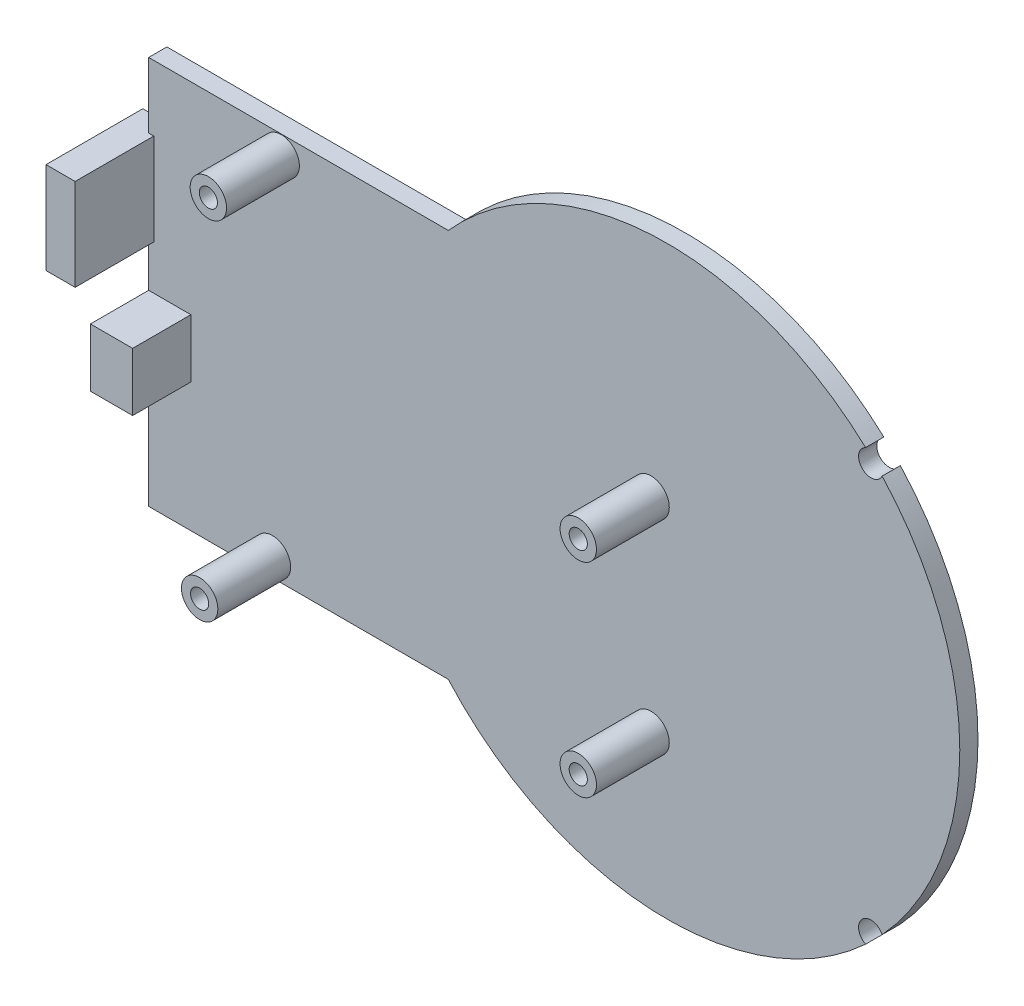
ISO-10303-21;
HEADER;
FILE_DESCRIPTION(('STEP AP214'),'2;1');
FILE_NAME('part.step','',(''),(''),'','','');
FILE_SCHEMA(('AUTOMOTIVE_DESIGN { 1 0 10303 214 1 1 1 1 }'));
ENDSEC;
DATA;
#1=APPLICATION_CONTEXT('core data for automotive mechanical design processes');
#2=APPLICATION_PROTOCOL_DEFINITION('international standard','automotive_design',2000,#1);
#3=PRODUCT_CONTEXT('',#1,'mechanical');
#4=PRODUCT('Part','Part','',(#3));
#5=PRODUCT_RELATED_PRODUCT_CATEGORY('part','',(#4));
#6=PRODUCT_DEFINITION_FORMATION('','',#4);
#7=PRODUCT_DEFINITION_CONTEXT('part definition',#1,'design');
#8=PRODUCT_DEFINITION('design','',#6,#7);
#9=PRODUCT_DEFINITION_SHAPE('','',#8);
#10=(LENGTH_UNIT() NAMED_UNIT(*) SI_UNIT(.MILLI.,.METRE.));
#11=(NAMED_UNIT(*) PLANE_ANGLE_UNIT() SI_UNIT($,.RADIAN.));
#12=(NAMED_UNIT(*) SI_UNIT($,.STERADIAN.) SOLID_ANGLE_UNIT());
#13=UNCERTAINTY_MEASURE_WITH_UNIT(LENGTH_MEASURE(1.E-05),#10,'distance_accuracy_value','');
#14=(GEOMETRIC_REPRESENTATION_CONTEXT(3) GLOBAL_UNCERTAINTY_ASSIGNED_CONTEXT((#13)) GLOBAL_UNIT_ASSIGNED_CONTEXT((#10,
#11,#12)) REPRESENTATION_CONTEXT('',''));
#15=CARTESIAN_POINT('',(0.,0.,0.));
#16=DIRECTION('',(0.,0.,1.));
#17=DIRECTION('',(1.,0.,0.));
#18=AXIS2_PLACEMENT_3D('',#15,#16,#17);
#19=CARTESIAN_POINT('',(0.,0.,8.5));
#20=DIRECTION('',(0.,0.,-1.));
#21=DIRECTION('',(-1.,0.,0.));
#22=AXIS2_PLACEMENT_3D('',#19,#20,#21);
#23=PLANE('',#22);
#24=CARTESIAN_POINT('',(-54.2,-24.17,8.5));
#25=DIRECTION('',(0.,0.,1.));
#26=DIRECTION('',(1.,0.,0.));
#27=AXIS2_PLACEMENT_3D('',#24,#25,#26);
#28=CIRCLE('',#27,2.5);
#29=CARTESIAN_POINT('',(-51.7,-24.17,8.5));
#30=VERTEX_POINT('',#29);
#31=EDGE_CURVE('E314',#30,#30,#28,.T.);
#32=ORIENTED_EDGE('',*,*,#31,.F.);
#33=EDGE_LOOP('',(#32));
#34=FACE_BOUND('',#33,.T.);
#35=CARTESIAN_POINT('',(-2.2,8.93,8.5));
#36=DIRECTION('',(0.,0.,1.));
#37=DIRECTION('',(1.,0.,0.));
#38=AXIS2_PLACEMENT_3D('',#35,#36,#37);
#39=CIRCLE('',#38,2.5);
#40=CARTESIAN_POINT('',(0.3,8.93,8.5));
#41=VERTEX_POINT('',#40);
#42=EDGE_CURVE('E317',#41,#41,#39,.T.);
#43=ORIENTED_EDGE('',*,*,#42,.F.);
#44=EDGE_LOOP('',(#43));
#45=FACE_BOUND('',#44,.T.);
#46=CARTESIAN_POINT('',(-2.2,-19.07,8.5));
#47=DIRECTION('',(0.,0.,1.));
#48=DIRECTION('',(1.,0.,0.));
#49=AXIS2_PLACEMENT_3D('',#46,#47,#48);
#50=CIRCLE('',#49,2.5);
#51=CARTESIAN_POINT('',(0.3,-19.07,8.5));
#52=VERTEX_POINT('',#51);
#53=EDGE_CURVE('E323',#52,#52,#50,.T.);
#54=ORIENTED_EDGE('',*,*,#53,.F.);
#55=EDGE_LOOP('',(#54));
#56=FACE_BOUND('',#55,.T.);
#57=CARTESIAN_POINT('',(-53.,24.13,8.5));
#58=DIRECTION('',(0.,0.,1.));
#59=DIRECTION('',(1.,0.,0.));
#60=AXIS2_PLACEMENT_3D('',#57,#58,#59);
#61=CIRCLE('',#60,2.5);
#62=CARTESIAN_POINT('',(-50.5,24.13,8.5));
#63=VERTEX_POINT('',#62);
#64=EDGE_CURVE('E327',#63,#63,#61,.T.);
#65=ORIENTED_EDGE('',*,*,#64,.F.);
#66=EDGE_LOOP('',(#65));
#67=FACE_BOUND('',#66,.T.);
#68=DIRECTION('',(1.,0.,0.));
#69=VECTOR('',#68,1.);
#70=CARTESIAN_POINT('',(0.,5.1,8.5));
#71=LINE('',#70,#69);
#72=CARTESIAN_POINT('',(-71.2,5.09999999999999,8.5));
#73=VERTEX_POINT('',#72);
#74=CARTESIAN_POINT('',(-70.5,5.1,8.5));
#75=VERTEX_POINT('',#74);
#76=EDGE_CURVE('E207',#73,#75,#71,.T.);
#77=ORIENTED_EDGE('',*,*,#76,.F.);
#78=DIRECTION('',(0.,-1.,0.));
#79=VECTOR('',#78,1.);
#80=CARTESIAN_POINT('',(-71.2,-26.7,8.5));
#81=LINE('',#80,#79);
#82=CARTESIAN_POINT('',(-71.2,-1.00000000000001,8.5));
#83=VERTEX_POINT('',#82);
#84=EDGE_CURVE('E368',#73,#83,#81,.T.);
#85=ORIENTED_EDGE('',*,*,#84,.T.);
#86=DIRECTION('',(-1.,0.,0.));
#87=VECTOR('',#86,1.);
#88=CARTESIAN_POINT('',(-71.2,-1.,8.5));
#89=LINE('',#88,#87);
#90=CARTESIAN_POINT('',(-65.4,-1.,8.5));
#91=VERTEX_POINT('',#90);
#92=EDGE_CURVE('E275',#91,#83,#89,.T.);
#93=ORIENTED_EDGE('',*,*,#92,.F.);
#94=DIRECTION('',(0.,1.,0.));
#95=VECTOR('',#94,1.);
#96=CARTESIAN_POINT('',(-65.4,-9.,8.5));
#97=LINE('',#96,#95);
#98=CARTESIAN_POINT('',(-65.4,-9.,8.5));
#99=VERTEX_POINT('',#98);
#100=EDGE_CURVE('E282',#99,#91,#97,.T.);
#101=ORIENTED_EDGE('',*,*,#100,.F.);
#102=DIRECTION('',(1.,0.,0.));
#103=VECTOR('',#102,1.);
#104=CARTESIAN_POINT('',(-71.2,-9.,8.5));
#105=LINE('',#104,#103);
#106=CARTESIAN_POINT('',(-71.2,-9.00000000000001,8.5));
#107=VERTEX_POINT('',#106);
#108=EDGE_CURVE('E266',#107,#99,#105,.T.);
#109=ORIENTED_EDGE('',*,*,#108,.F.);
#110=CARTESIAN_POINT('',(-71.2,-26.7,8.5));
#111=VERTEX_POINT('',#110);
#112=EDGE_CURVE('E370',#107,#111,#81,.T.);
#113=ORIENTED_EDGE('',*,*,#112,.T.);
#114=DIRECTION('',(1.,0.,0.));
#115=VECTOR('',#114,1.);
#116=CARTESIAN_POINT('',(-71.2,-26.7,8.5));
#117=LINE('',#116,#115);
#118=CARTESIAN_POINT('',(-30.0524541427152,-26.7,8.5));
#119=VERTEX_POINT('',#118);
#120=EDGE_CURVE('E364',#111,#119,#117,.T.);
#121=ORIENTED_EDGE('',*,*,#120,.T.);
#122=CARTESIAN_POINT('',(0.,0.,8.5));
#123=DIRECTION('',(0.,0.,1.));
#124=DIRECTION('',(1.,0.,0.));
#125=AXIS2_PLACEMENT_3D('',#122,#123,#124);
#126=CIRCLE('',#125,40.2);
#127=CARTESIAN_POINT('',(27.2706541463464,-29.5355958536536,8.5));
#128=VERTEX_POINT('',#127);
#129=EDGE_CURVE('E345',#119,#128,#126,.T.);
#130=ORIENTED_EDGE('',*,*,#129,.T.);
#131=CARTESIAN_POINT('',(28.,-28.,8.5));
#132=DIRECTION('',(0.,0.,-1.));
#133=DIRECTION('',(-1.,0.,0.));
#134=AXIS2_PLACEMENT_3D('',#131,#132,#133);
#135=CIRCLE('',#134,1.7);
#136=CARTESIAN_POINT('',(29.5355958536536,-27.2706541463464,8.5));
#137=VERTEX_POINT('',#136);
#138=EDGE_CURVE('E263',#137,#128,#135,.F.);
#139=ORIENTED_EDGE('',*,*,#138,.F.);
#140=CARTESIAN_POINT('',(29.5355958536536,27.2706541463464,8.5));
#141=VERTEX_POINT('',#140);
#142=EDGE_CURVE('E350',#137,#141,#126,.T.);
#143=ORIENTED_EDGE('',*,*,#142,.T.);
#144=CARTESIAN_POINT('',(28.,28.,8.5));
#145=DIRECTION('',(0.,0.,-1.));
#146=DIRECTION('',(-1.,0.,0.));
#147=AXIS2_PLACEMENT_3D('',#144,#145,#146);
#148=CIRCLE('',#147,1.7);
#149=CARTESIAN_POINT('',(27.2706541463464,29.5355958536536,8.5));
#150=VERTEX_POINT('',#149);
#151=EDGE_CURVE('E260',#150,#141,#148,.F.);
#152=ORIENTED_EDGE('',*,*,#151,.F.);
#153=CARTESIAN_POINT('',(-30.0524541427152,26.7,8.5));
#154=VERTEX_POINT('',#153);
#155=EDGE_CURVE('E346',#150,#154,#126,.T.);
#156=ORIENTED_EDGE('',*,*,#155,.T.);
#157=DIRECTION('',(-1.,0.,0.));
#158=VECTOR('',#157,1.);
#159=CARTESIAN_POINT('',(-71.2,26.7,8.5));
#160=LINE('',#159,#158);
#161=CARTESIAN_POINT('',(-71.2,26.7,8.5));
#162=VERTEX_POINT('',#161);
#163=EDGE_CURVE('E371',#154,#162,#160,.T.);
#164=ORIENTED_EDGE('',*,*,#163,.T.);
#165=CARTESIAN_POINT('',(-71.2,17.7,8.5));
#166=VERTEX_POINT('',#165);
#167=EDGE_CURVE('E362',#162,#166,#81,.T.);
#168=ORIENTED_EDGE('',*,*,#167,.T.);
#169=DIRECTION('',(-1.,0.,0.));
#170=VECTOR('',#169,1.);
#171=CARTESIAN_POINT('',(0.,17.7,8.5));
#172=LINE('',#171,#170);
#173=CARTESIAN_POINT('',(-70.5,17.7,8.5));
#174=VERTEX_POINT('',#173);
#175=EDGE_CURVE('E68',#174,#166,#172,.T.);
#176=ORIENTED_EDGE('',*,*,#175,.F.);
#177=DIRECTION('',(0.,1.,0.));
#178=VECTOR('',#177,1.);
#179=CARTESIAN_POINT('',(-70.5,0.,8.5));
#180=LINE('',#179,#178);
#181=EDGE_CURVE('E64',#75,#174,#180,.T.);
#182=ORIENTED_EDGE('',*,*,#181,.F.);
#183=EDGE_LOOP('',(#77,#85,#93,#101,#109,#113,#121,#130,#139,#143,#152,#156,#164,#168,#176,#182));
#184=FACE_BOUND('',#183,.T.);
#185=ADVANCED_FACE('F44',(#34,#45,#56,#67,#184),#23,.F.);
#186=CARTESIAN_POINT('',(-71.2,-26.7,8.5));
#187=DIRECTION('',(1.,0.,0.));
#188=DIRECTION('',(0.,0.,-1.));
#189=AXIS2_PLACEMENT_3D('',#186,#187,#188);
#190=PLANE('',#189);
#191=CARTESIAN_POINT('',(-71.2,-5.,12.5));
#192=DIRECTION('',(1.,0.,0.));
#193=DIRECTION('',(0.,0.,-1.));
#194=AXIS2_PLACEMENT_3D('',#191,#192,#193);
#195=CIRCLE('',#194,2.1);
#196=CARTESIAN_POINT('',(-71.2,-5.,10.4));
#197=VERTEX_POINT('',#196);
#198=EDGE_CURVE('E215',#197,#197,#195,.T.);
#199=ORIENTED_EDGE('',*,*,#198,.T.);
#200=EDGE_LOOP('',(#199));
#201=FACE_BOUND('',#200,.T.);
#202=DIRECTION('',(0.,0.,1.));
#203=VECTOR('',#202,1.);
#204=CARTESIAN_POINT('',(-71.2,5.1,8.5));
#205=LINE('',#204,#203);
#206=CARTESIAN_POINT('',(-71.2,5.09999999999999,6.));
#207=VERTEX_POINT('',#206);
#208=EDGE_CURVE('E11',#207,#73,#205,.T.);
#209=ORIENTED_EDGE('',*,*,#208,.F.);
#210=DIRECTION('',(0.,-1.,0.));
#211=VECTOR('',#210,1.);
#212=CARTESIAN_POINT('',(-71.2,-26.7,6.));
#213=LINE('',#212,#211);
#214=CARTESIAN_POINT('',(-71.2,-26.7,6.));
#215=VERTEX_POINT('',#214);
#216=EDGE_CURVE('E363',#207,#215,#213,.T.);
#217=ORIENTED_EDGE('',*,*,#216,.T.);
#218=DIRECTION('',(0.,0.,-1.));
#219=VECTOR('',#218,1.);
#220=CARTESIAN_POINT('',(-71.2,-26.7,8.5));
#221=LINE('',#220,#219);
#222=EDGE_CURVE('E335',#111,#215,#221,.T.);
#223=ORIENTED_EDGE('',*,*,#222,.F.);
#224=ORIENTED_EDGE('',*,*,#112,.F.);
#225=DIRECTION('',(0.,0.,-1.));
#226=VECTOR('',#225,1.);
#227=CARTESIAN_POINT('',(-71.2,-9.,16.5));
#228=LINE('',#227,#226);
#229=CARTESIAN_POINT('',(-71.2,-9.,16.5));
#230=VERTEX_POINT('',#229);
#231=EDGE_CURVE('E301',#230,#107,#228,.T.);
#232=ORIENTED_EDGE('',*,*,#231,.F.);
#233=DIRECTION('',(0.,-1.,0.));
#234=VECTOR('',#233,1.);
#235=CARTESIAN_POINT('',(-71.2,-9.,16.5));
#236=LINE('',#235,#234);
#237=CARTESIAN_POINT('',(-71.2,-1.,16.5));
#238=VERTEX_POINT('',#237);
#239=EDGE_CURVE('E270',#238,#230,#236,.T.);
#240=ORIENTED_EDGE('',*,*,#239,.F.);
#241=DIRECTION('',(0.,0.,-1.));
#242=VECTOR('',#241,1.);
#243=CARTESIAN_POINT('',(-71.2,-1.,16.5));
#244=LINE('',#243,#242);
#245=EDGE_CURVE('E284',#238,#83,#244,.T.);
#246=ORIENTED_EDGE('',*,*,#245,.T.);
#247=ORIENTED_EDGE('',*,*,#84,.F.);
#248=EDGE_LOOP('',(#209,#217,#223,#224,#232,#240,#246,#247));
#249=FACE_BOUND('',#248,.T.);
#250=ADVANCED_FACE('F50',(#201,#249),#190,.F.);
#251=DIRECTION('',(0.,0.,-1.));
#252=VECTOR('',#251,1.);
#253=CARTESIAN_POINT('',(-71.2,17.7,8.5));
#254=LINE('',#253,#252);
#255=CARTESIAN_POINT('',(-71.2,17.7,6.));
#256=VERTEX_POINT('',#255);
#257=EDGE_CURVE('E53',#166,#256,#254,.T.);
#258=ORIENTED_EDGE('',*,*,#257,.F.);
#259=ORIENTED_EDGE('',*,*,#167,.F.);
#260=DIRECTION('',(0.,0.,-1.));
#261=VECTOR('',#260,1.);
#262=CARTESIAN_POINT('',(-71.2,26.7,8.5));
#263=LINE('',#262,#261);
#264=CARTESIAN_POINT('',(-71.2,26.7,6.));
#265=VERTEX_POINT('',#264);
#266=EDGE_CURVE('E372',#162,#265,#263,.T.);
#267=ORIENTED_EDGE('',*,*,#266,.T.);
#268=EDGE_CURVE('E374',#265,#256,#213,.T.);
#269=ORIENTED_EDGE('',*,*,#268,.T.);
#270=EDGE_LOOP('',(#258,#259,#267,#269));
#271=FACE_BOUND('',#270,.T.);
#272=ADVANCED_FACE('F450',(#271),#190,.F.);
#273=CARTESIAN_POINT('',(0.,0.,8.5));
#274=DIRECTION('',(0.,0.,-1.));
#275=DIRECTION('',(-1.,0.,0.));
#276=AXIS2_PLACEMENT_3D('',#273,#274,#275);
#277=CYLINDRICAL_SURFACE('',#276,40.2);
#278=DIRECTION('',(0.,0.,-1.));
#279=VECTOR('',#278,1.);
#280=CARTESIAN_POINT('',(27.2706541463464,-29.5355958536536,12.25));
#281=LINE('',#280,#279);
#282=CARTESIAN_POINT('',(27.2706541463464,-29.5355958536536,6.));
#283=VERTEX_POINT('',#282);
#284=EDGE_CURVE('E396',#128,#283,#281,.T.);
#285=ORIENTED_EDGE('',*,*,#284,.F.);
#286=ORIENTED_EDGE('',*,*,#129,.F.);
#287=DIRECTION('',(0.,0.,-1.));
#288=VECTOR('',#287,1.);
#289=CARTESIAN_POINT('',(-30.0524541427152,-26.7,8.5));
#290=LINE('',#289,#288);
#291=CARTESIAN_POINT('',(-30.0524541427152,-26.7,6.));
#292=VERTEX_POINT('',#291);
#293=EDGE_CURVE('E360',#119,#292,#290,.T.);
#294=ORIENTED_EDGE('',*,*,#293,.T.);
#295=CARTESIAN_POINT('',(0.,0.,6.));
#296=DIRECTION('',(0.,0.,1.));
#297=DIRECTION('',(1.,0.,0.));
#298=AXIS2_PLACEMENT_3D('',#295,#296,#297);
#299=CIRCLE('',#298,40.2);
#300=EDGE_CURVE('E349',#292,#283,#299,.T.);
#301=ORIENTED_EDGE('',*,*,#300,.T.);
#302=EDGE_LOOP('',(#285,#286,#294,#301));
#303=FACE_BOUND('',#302,.T.);
#304=ADVANCED_FACE('F452',(#303),#277,.T.);
#305=DIRECTION('',(0.,0.,-1.));
#306=VECTOR('',#305,1.);
#307=CARTESIAN_POINT('',(29.5355958536536,-27.2706541463464,12.25));
#308=LINE('',#307,#306);
#309=CARTESIAN_POINT('',(29.5355958536536,-27.2706541463464,6.));
#310=VERTEX_POINT('',#309);
#311=EDGE_CURVE('E392',#310,#137,#308,.F.);
#312=ORIENTED_EDGE('',*,*,#311,.F.);
#313=CARTESIAN_POINT('',(29.5355958536536,27.2706541463464,6.));
#314=VERTEX_POINT('',#313);
#315=EDGE_CURVE('E355',#310,#314,#299,.T.);
#316=ORIENTED_EDGE('',*,*,#315,.T.);
#317=DIRECTION('',(0.,0.,-1.));
#318=VECTOR('',#317,1.);
#319=CARTESIAN_POINT('',(29.5355958536536,27.2706541463464,12.25));
#320=LINE('',#319,#318);
#321=EDGE_CURVE('E391',#141,#314,#320,.T.);
#322=ORIENTED_EDGE('',*,*,#321,.F.);
#323=ORIENTED_EDGE('',*,*,#142,.F.);
#324=EDGE_LOOP('',(#312,#316,#322,#323));
#325=FACE_BOUND('',#324,.T.);
#326=ADVANCED_FACE('F467',(#325),#277,.T.);
#327=DIRECTION('',(0.,0.,-1.));
#328=VECTOR('',#327,1.);
#329=CARTESIAN_POINT('',(27.2706541463464,29.5355958536536,12.25));
#330=LINE('',#329,#328);
#331=CARTESIAN_POINT('',(27.2706541463464,29.5355958536536,6.));
#332=VERTEX_POINT('',#331);
#333=EDGE_CURVE('E318',#332,#150,#330,.F.);
#334=ORIENTED_EDGE('',*,*,#333,.F.);
#335=CARTESIAN_POINT('',(-30.0524541427152,26.7,6.));
#336=VERTEX_POINT('',#335);
#337=EDGE_CURVE('E315',#332,#336,#299,.T.);
#338=ORIENTED_EDGE('',*,*,#337,.T.);
#339=DIRECTION('',(0.,0.,-1.));
#340=VECTOR('',#339,1.);
#341=CARTESIAN_POINT('',(-30.0524541427152,26.7,8.5));
#342=LINE('',#341,#340);
#343=EDGE_CURVE('E347',#336,#154,#342,.F.);
#344=ORIENTED_EDGE('',*,*,#343,.T.);
#345=ORIENTED_EDGE('',*,*,#155,.F.);
#346=EDGE_LOOP('',(#334,#338,#344,#345));
#347=FACE_BOUND('',#346,.T.);
#348=ADVANCED_FACE('F463',(#347),#277,.T.);
#349=CARTESIAN_POINT('',(-71.2,-26.7,8.5));
#350=DIRECTION('',(0.,1.,0.));
#351=DIRECTION('',(0.,0.,1.));
#352=AXIS2_PLACEMENT_3D('',#349,#350,#351);
#353=PLANE('',#352);
#354=ORIENTED_EDGE('',*,*,#293,.F.);
#355=ORIENTED_EDGE('',*,*,#120,.F.);
#356=ORIENTED_EDGE('',*,*,#222,.T.);
#357=DIRECTION('',(1.,0.,0.));
#358=VECTOR('',#357,1.);
#359=CARTESIAN_POINT('',(-71.2,-26.7,6.));
#360=LINE('',#359,#358);
#361=EDGE_CURVE('E378',#215,#292,#360,.T.);
#362=ORIENTED_EDGE('',*,*,#361,.T.);
#363=EDGE_LOOP('',(#354,#355,#356,#362));
#364=FACE_BOUND('',#363,.T.);
#365=ADVANCED_FACE('F464',(#364),#353,.F.);
#366=CARTESIAN_POINT('',(-71.2,26.7,8.5));
#367=DIRECTION('',(0.,-1.,0.));
#368=DIRECTION('',(0.,0.,-1.));
#369=AXIS2_PLACEMENT_3D('',#366,#367,#368);
#370=PLANE('',#369);
#371=ORIENTED_EDGE('',*,*,#343,.F.);
#372=DIRECTION('',(-1.,0.,0.));
#373=VECTOR('',#372,1.);
#374=CARTESIAN_POINT('',(-71.2,26.7,6.));
#375=LINE('',#374,#373);
#376=EDGE_CURVE('E381',#336,#265,#375,.T.);
#377=ORIENTED_EDGE('',*,*,#376,.T.);
#378=ORIENTED_EDGE('',*,*,#266,.F.);
#379=ORIENTED_EDGE('',*,*,#163,.F.);
#380=EDGE_LOOP('',(#371,#377,#378,#379));
#381=FACE_BOUND('',#380,.T.);
#382=ADVANCED_FACE('F459',(#381),#370,.F.);
#383=CARTESIAN_POINT('',(0.,0.,6.));
#384=DIRECTION('',(0.,0.,-1.));
#385=DIRECTION('',(-1.,0.,0.));
#386=AXIS2_PLACEMENT_3D('',#383,#384,#385);
#387=PLANE('',#386);
#388=ORIENTED_EDGE('',*,*,#216,.F.);
#389=DIRECTION('',(1.,0.,0.));
#390=VECTOR('',#389,1.);
#391=CARTESIAN_POINT('',(-74.5,5.1,6.));
#392=LINE('',#391,#390);
#393=CARTESIAN_POINT('',(-74.5,5.1,6.));
#394=VERTEX_POINT('',#393);
#395=EDGE_CURVE('E414',#394,#207,#392,.T.);
#396=ORIENTED_EDGE('',*,*,#395,.F.);
#397=DIRECTION('',(0.,-1.,0.));
#398=VECTOR('',#397,1.);
#399=CARTESIAN_POINT('',(-74.5,17.7,6.));
#400=LINE('',#399,#398);
#401=CARTESIAN_POINT('',(-74.5,17.7,6.));
#402=VERTEX_POINT('',#401);
#403=EDGE_CURVE('E197',#402,#394,#400,.T.);
#404=ORIENTED_EDGE('',*,*,#403,.F.);
#405=DIRECTION('',(-1.,0.,0.));
#406=VECTOR('',#405,1.);
#407=CARTESIAN_POINT('',(-70.5,17.7,6.));
#408=LINE('',#407,#406);
#409=EDGE_CURVE('E191',#256,#402,#408,.T.);
#410=ORIENTED_EDGE('',*,*,#409,.F.);
#411=ORIENTED_EDGE('',*,*,#268,.F.);
#412=ORIENTED_EDGE('',*,*,#376,.F.);
#413=ORIENTED_EDGE('',*,*,#337,.F.);
#414=CARTESIAN_POINT('',(28.,28.,6.));
#415=DIRECTION('',(0.,0.,1.));
#416=DIRECTION('',(1.,0.,0.));
#417=AXIS2_PLACEMENT_3D('',#414,#415,#416);
#418=CIRCLE('',#417,1.7);
#419=EDGE_CURVE('E227',#332,#314,#418,.T.);
#420=ORIENTED_EDGE('',*,*,#419,.T.);
#421=ORIENTED_EDGE('',*,*,#315,.F.);
#422=CARTESIAN_POINT('',(28.,-28.,6.));
#423=DIRECTION('',(0.,0.,1.));
#424=DIRECTION('',(1.,0.,0.));
#425=AXIS2_PLACEMENT_3D('',#422,#423,#424);
#426=CIRCLE('',#425,1.7);
#427=EDGE_CURVE('E220',#310,#283,#426,.T.);
#428=ORIENTED_EDGE('',*,*,#427,.T.);
#429=ORIENTED_EDGE('',*,*,#300,.F.);
#430=ORIENTED_EDGE('',*,*,#361,.F.);
#431=EDGE_LOOP('',(#388,#396,#404,#410,#411,#412,#413,#420,#421,#428,#429,#430));
#432=FACE_BOUND('',#431,.T.);
#433=CARTESIAN_POINT('',(-53.,24.13,6.));
#434=DIRECTION('',(0.,0.,1.));
#435=DIRECTION('',(1.,0.,0.));
#436=AXIS2_PLACEMENT_3D('',#433,#434,#435);
#437=CIRCLE('',#436,1.25);
#438=CARTESIAN_POINT('',(-51.75,24.13,6.));
#439=VERTEX_POINT('',#438);
#440=EDGE_CURVE('E232',#439,#439,#437,.T.);
#441=ORIENTED_EDGE('',*,*,#440,.T.);
#442=EDGE_LOOP('',(#441));
#443=FACE_BOUND('',#442,.T.);
#444=CARTESIAN_POINT('',(-2.2,-19.07,6.));
#445=DIRECTION('',(0.,0.,1.));
#446=DIRECTION('',(1.,0.,0.));
#447=AXIS2_PLACEMENT_3D('',#444,#445,#446);
#448=CIRCLE('',#447,1.25);
#449=CARTESIAN_POINT('',(-0.95,-19.07,6.));
#450=VERTEX_POINT('',#449);
#451=EDGE_CURVE('E245',#450,#450,#448,.T.);
#452=ORIENTED_EDGE('',*,*,#451,.T.);
#453=EDGE_LOOP('',(#452));
#454=FACE_BOUND('',#453,.T.);
#455=CARTESIAN_POINT('',(-2.2,8.93,6.));
#456=DIRECTION('',(0.,0.,1.));
#457=DIRECTION('',(1.,0.,0.));
#458=AXIS2_PLACEMENT_3D('',#455,#456,#457);
#459=CIRCLE('',#458,1.25);
#460=CARTESIAN_POINT('',(-0.95,8.93,6.));
#461=VERTEX_POINT('',#460);
#462=EDGE_CURVE('E222',#461,#461,#459,.T.);
#463=ORIENTED_EDGE('',*,*,#462,.T.);
#464=EDGE_LOOP('',(#463));
#465=FACE_BOUND('',#464,.T.);
#466=CARTESIAN_POINT('',(-54.2,-24.17,6.));
#467=DIRECTION('',(0.,0.,1.));
#468=DIRECTION('',(1.,0.,0.));
#469=AXIS2_PLACEMENT_3D('',#466,#467,#468);
#470=CIRCLE('',#469,1.25);
#471=CARTESIAN_POINT('',(-52.95,-24.17,6.));
#472=VERTEX_POINT('',#471);
#473=EDGE_CURVE('E236',#472,#472,#470,.T.);
#474=ORIENTED_EDGE('',*,*,#473,.T.);
#475=EDGE_LOOP('',(#474));
#476=FACE_BOUND('',#475,.T.);
#477=ADVANCED_FACE('F413',(#432,#443,#454,#465,#476),#387,.T.);
#478=CARTESIAN_POINT('',(-53.,24.13,18.5));
#479=DIRECTION('',(0.,0.,-1.));
#480=DIRECTION('',(-1.,0.,0.));
#481=AXIS2_PLACEMENT_3D('',#478,#479,#480);
#482=CYLINDRICAL_SURFACE('',#481,2.5);
#483=CARTESIAN_POINT('',(-53.,24.13,18.5));
#484=DIRECTION('',(0.,0.,1.));
#485=DIRECTION('',(1.,0.,0.));
#486=AXIS2_PLACEMENT_3D('',#483,#484,#485);
#487=CIRCLE('',#486,2.5);
#488=CARTESIAN_POINT('',(-50.5,24.13,18.5));
#489=VERTEX_POINT('',#488);
#490=EDGE_CURVE('E311',#489,#489,#487,.T.);
#491=ORIENTED_EDGE('',*,*,#490,.F.);
#492=EDGE_LOOP('',(#491));
#493=FACE_BOUND('',#492,.T.);
#494=ORIENTED_EDGE('',*,*,#64,.T.);
#495=EDGE_LOOP('',(#494));
#496=FACE_BOUND('',#495,.T.);
#497=ADVANCED_FACE('F456',(#493,#496),#482,.T.);
#498=CARTESIAN_POINT('',(-53.,24.13,18.5));
#499=DIRECTION('',(0.,0.,1.));
#500=DIRECTION('',(1.,0.,0.));
#501=AXIS2_PLACEMENT_3D('',#498,#499,#500);
#502=PLANE('',#501);
#503=CARTESIAN_POINT('',(-53.,24.13,18.5));
#504=DIRECTION('',(0.,0.,1.));
#505=DIRECTION('',(1.,0.,0.));
#506=AXIS2_PLACEMENT_3D('',#503,#504,#505);
#507=CIRCLE('',#506,1.25);
#508=CARTESIAN_POINT('',(-51.75,24.13,18.5));
#509=VERTEX_POINT('',#508);
#510=EDGE_CURVE('E239',#509,#509,#507,.T.);
#511=ORIENTED_EDGE('',*,*,#510,.F.);
#512=EDGE_LOOP('',(#511));
#513=FACE_BOUND('',#512,.T.);
#514=ORIENTED_EDGE('',*,*,#490,.T.);
#515=EDGE_LOOP('',(#514));
#516=FACE_BOUND('',#515,.T.);
#517=ADVANCED_FACE('F557',(#513,#516),#502,.T.);
#518=CARTESIAN_POINT('',(-2.2,-19.07,18.5));
#519=DIRECTION('',(0.,0.,-1.));
#520=DIRECTION('',(-1.,0.,0.));
#521=AXIS2_PLACEMENT_3D('',#518,#519,#520);
#522=CYLINDRICAL_SURFACE('',#521,2.5);
#523=CARTESIAN_POINT('',(-2.2,-19.07,18.5));
#524=DIRECTION('',(0.,0.,1.));
#525=DIRECTION('',(1.,0.,0.));
#526=AXIS2_PLACEMENT_3D('',#523,#524,#525);
#527=CIRCLE('',#526,2.5);
#528=CARTESIAN_POINT('',(0.3,-19.07,18.5));
#529=VERTEX_POINT('',#528);
#530=EDGE_CURVE('E330',#529,#529,#527,.T.);
#531=ORIENTED_EDGE('',*,*,#530,.F.);
#532=EDGE_LOOP('',(#531));
#533=FACE_BOUND('',#532,.T.);
#534=ORIENTED_EDGE('',*,*,#53,.T.);
#535=EDGE_LOOP('',(#534));
#536=FACE_BOUND('',#535,.T.);
#537=ADVANCED_FACE('F562',(#533,#536),#522,.T.);
#538=CARTESIAN_POINT('',(-2.2,-19.07,18.5));
#539=DIRECTION('',(0.,0.,1.));
#540=DIRECTION('',(1.,0.,0.));
#541=AXIS2_PLACEMENT_3D('',#538,#539,#540);
#542=PLANE('',#541);
#543=CARTESIAN_POINT('',(-2.2,-19.07,18.5));
#544=DIRECTION('',(0.,0.,1.));
#545=DIRECTION('',(1.,0.,0.));
#546=AXIS2_PLACEMENT_3D('',#543,#544,#545);
#547=CIRCLE('',#546,1.25);
#548=CARTESIAN_POINT('',(-0.95,-19.07,18.5));
#549=VERTEX_POINT('',#548);
#550=EDGE_CURVE('E223',#549,#549,#547,.T.);
#551=ORIENTED_EDGE('',*,*,#550,.F.);
#552=EDGE_LOOP('',(#551));
#553=FACE_BOUND('',#552,.T.);
#554=ORIENTED_EDGE('',*,*,#530,.T.);
#555=EDGE_LOOP('',(#554));
#556=FACE_BOUND('',#555,.T.);
#557=ADVANCED_FACE('F554',(#553,#556),#542,.T.);
#558=CARTESIAN_POINT('',(-2.2,8.93,18.5));
#559=DIRECTION('',(0.,0.,-1.));
#560=DIRECTION('',(-1.,0.,0.));
#561=AXIS2_PLACEMENT_3D('',#558,#559,#560);
#562=CYLINDRICAL_SURFACE('',#561,2.5);
#563=CARTESIAN_POINT('',(-2.2,8.93,18.5));
#564=DIRECTION('',(0.,0.,1.));
#565=DIRECTION('',(1.,0.,0.));
#566=AXIS2_PLACEMENT_3D('',#563,#564,#565);
#567=CIRCLE('',#566,2.5);
#568=CARTESIAN_POINT('',(0.3,8.93,18.5));
#569=VERTEX_POINT('',#568);
#570=EDGE_CURVE('E307',#569,#569,#567,.T.);
#571=ORIENTED_EDGE('',*,*,#570,.F.);
#572=EDGE_LOOP('',(#571));
#573=FACE_BOUND('',#572,.T.);
#574=ORIENTED_EDGE('',*,*,#42,.T.);
#575=EDGE_LOOP('',(#574));
#576=FACE_BOUND('',#575,.T.);
#577=ADVANCED_FACE('F549',(#573,#576),#562,.T.);
#578=CARTESIAN_POINT('',(-2.2,8.93,18.5));
#579=DIRECTION('',(0.,0.,1.));
#580=DIRECTION('',(1.,0.,0.));
#581=AXIS2_PLACEMENT_3D('',#578,#579,#580);
#582=PLANE('',#581);
#583=CARTESIAN_POINT('',(-2.2,8.93,18.5));
#584=DIRECTION('',(0.,0.,1.));
#585=DIRECTION('',(1.,0.,0.));
#586=AXIS2_PLACEMENT_3D('',#583,#584,#585);
#587=CIRCLE('',#586,1.25);
#588=CARTESIAN_POINT('',(-0.95,8.93,18.5));
#589=VERTEX_POINT('',#588);
#590=EDGE_CURVE('E229',#589,#589,#587,.T.);
#591=ORIENTED_EDGE('',*,*,#590,.F.);
#592=EDGE_LOOP('',(#591));
#593=FACE_BOUND('',#592,.T.);
#594=ORIENTED_EDGE('',*,*,#570,.T.);
#595=EDGE_LOOP('',(#594));
#596=FACE_BOUND('',#595,.T.);
#597=ADVANCED_FACE('F547',(#593,#596),#582,.T.);
#598=CARTESIAN_POINT('',(-54.2,-24.17,18.5));
#599=DIRECTION('',(0.,0.,-1.));
#600=DIRECTION('',(-1.,0.,0.));
#601=AXIS2_PLACEMENT_3D('',#598,#599,#600);
#602=CYLINDRICAL_SURFACE('',#601,2.5);
#603=CARTESIAN_POINT('',(-54.2,-24.17,18.5));
#604=DIRECTION('',(0.,0.,1.));
#605=DIRECTION('',(1.,0.,0.));
#606=AXIS2_PLACEMENT_3D('',#603,#604,#605);
#607=CIRCLE('',#606,2.5);
#608=CARTESIAN_POINT('',(-51.7,-24.17,18.5));
#609=VERTEX_POINT('',#608);
#610=EDGE_CURVE('E306',#609,#609,#607,.T.);
#611=ORIENTED_EDGE('',*,*,#610,.F.);
#612=EDGE_LOOP('',(#611));
#613=FACE_BOUND('',#612,.T.);
#614=ORIENTED_EDGE('',*,*,#31,.T.);
#615=EDGE_LOOP('',(#614));
#616=FACE_BOUND('',#615,.T.);
#617=ADVANCED_FACE('F542',(#613,#616),#602,.T.);
#618=CARTESIAN_POINT('',(-54.2,-24.17,18.5));
#619=DIRECTION('',(0.,0.,1.));
#620=DIRECTION('',(1.,0.,0.));
#621=AXIS2_PLACEMENT_3D('',#618,#619,#620);
#622=PLANE('',#621);
#623=CARTESIAN_POINT('',(-54.2,-24.17,18.5));
#624=DIRECTION('',(0.,0.,1.));
#625=DIRECTION('',(1.,0.,0.));
#626=AXIS2_PLACEMENT_3D('',#623,#624,#625);
#627=CIRCLE('',#626,1.25);
#628=CARTESIAN_POINT('',(-52.95,-24.17,18.5));
#629=VERTEX_POINT('',#628);
#630=EDGE_CURVE('E251',#629,#629,#627,.T.);
#631=ORIENTED_EDGE('',*,*,#630,.F.);
#632=EDGE_LOOP('',(#631));
#633=FACE_BOUND('',#632,.T.);
#634=ORIENTED_EDGE('',*,*,#610,.T.);
#635=EDGE_LOOP('',(#634));
#636=FACE_BOUND('',#635,.T.);
#637=ADVANCED_FACE('F539',(#633,#636),#622,.T.);
#638=CARTESIAN_POINT('',(-71.2,-9.,16.5));
#639=DIRECTION('',(0.,1.,0.));
#640=DIRECTION('',(0.,0.,1.));
#641=AXIS2_PLACEMENT_3D('',#638,#639,#640);
#642=PLANE('',#641);
#643=ORIENTED_EDGE('',*,*,#108,.T.);
#644=DIRECTION('',(0.,0.,-1.));
#645=VECTOR('',#644,1.);
#646=CARTESIAN_POINT('',(-65.4,-9.,16.5));
#647=LINE('',#646,#645);
#648=CARTESIAN_POINT('',(-65.4,-9.,16.5));
#649=VERTEX_POINT('',#648);
#650=EDGE_CURVE('E298',#649,#99,#647,.T.);
#651=ORIENTED_EDGE('',*,*,#650,.F.);
#652=DIRECTION('',(1.,0.,0.));
#653=VECTOR('',#652,1.);
#654=CARTESIAN_POINT('',(-71.2,-9.,16.5));
#655=LINE('',#654,#653);
#656=EDGE_CURVE('E271',#230,#649,#655,.T.);
#657=ORIENTED_EDGE('',*,*,#656,.F.);
#658=ORIENTED_EDGE('',*,*,#231,.T.);
#659=EDGE_LOOP('',(#643,#651,#657,#658));
#660=FACE_BOUND('',#659,.T.);
#661=ADVANCED_FACE('F536',(#660),#642,.F.);
#662=CARTESIAN_POINT('',(-65.4,-9.,16.5));
#663=DIRECTION('',(-1.,0.,0.));
#664=DIRECTION('',(0.,0.,1.));
#665=AXIS2_PLACEMENT_3D('',#662,#663,#664);
#666=PLANE('',#665);
#667=ORIENTED_EDGE('',*,*,#100,.T.);
#668=DIRECTION('',(0.,0.,-1.));
#669=VECTOR('',#668,1.);
#670=CARTESIAN_POINT('',(-65.4,-1.,16.5));
#671=LINE('',#670,#669);
#672=CARTESIAN_POINT('',(-65.4,-1.,16.5));
#673=VERTEX_POINT('',#672);
#674=EDGE_CURVE('E293',#673,#91,#671,.T.);
#675=ORIENTED_EDGE('',*,*,#674,.F.);
#676=DIRECTION('',(0.,1.,0.));
#677=VECTOR('',#676,1.);
#678=CARTESIAN_POINT('',(-65.4,-9.,16.5));
#679=LINE('',#678,#677);
#680=EDGE_CURVE('E274',#649,#673,#679,.T.);
#681=ORIENTED_EDGE('',*,*,#680,.F.);
#682=ORIENTED_EDGE('',*,*,#650,.T.);
#683=EDGE_LOOP('',(#667,#675,#681,#682));
#684=FACE_BOUND('',#683,.T.);
#685=ADVANCED_FACE('F535',(#684),#666,.F.);
#686=CARTESIAN_POINT('',(-71.2,-1.,16.5));
#687=DIRECTION('',(0.,-1.,0.));
#688=DIRECTION('',(0.,0.,-1.));
#689=AXIS2_PLACEMENT_3D('',#686,#687,#688);
#690=PLANE('',#689);
#691=ORIENTED_EDGE('',*,*,#92,.T.);
#692=ORIENTED_EDGE('',*,*,#245,.F.);
#693=DIRECTION('',(-1.,0.,0.));
#694=VECTOR('',#693,1.);
#695=CARTESIAN_POINT('',(-71.2,-1.,16.5));
#696=LINE('',#695,#694);
#697=EDGE_CURVE('E279',#673,#238,#696,.T.);
#698=ORIENTED_EDGE('',*,*,#697,.F.);
#699=ORIENTED_EDGE('',*,*,#674,.T.);
#700=EDGE_LOOP('',(#691,#692,#698,#699));
#701=FACE_BOUND('',#700,.T.);
#702=ADVANCED_FACE('F526',(#701),#690,.F.);
#703=CARTESIAN_POINT('',(0.,0.,16.5));
#704=DIRECTION('',(0.,0.,-1.));
#705=DIRECTION('',(-1.,0.,0.));
#706=AXIS2_PLACEMENT_3D('',#703,#704,#705);
#707=PLANE('',#706);
#708=ORIENTED_EDGE('',*,*,#239,.T.);
#709=ORIENTED_EDGE('',*,*,#656,.T.);
#710=ORIENTED_EDGE('',*,*,#680,.T.);
#711=ORIENTED_EDGE('',*,*,#697,.T.);
#712=EDGE_LOOP('',(#708,#709,#710,#711));
#713=FACE_BOUND('',#712,.T.);
#714=ADVANCED_FACE('F522',(#713),#707,.F.);
#715=CARTESIAN_POINT('',(-54.2,-24.17,18.5));
#716=DIRECTION('',(0.,0.,-1.));
#717=DIRECTION('',(-1.,0.,0.));
#718=AXIS2_PLACEMENT_3D('',#715,#716,#717);
#719=CYLINDRICAL_SURFACE('',#718,1.25);
#720=ORIENTED_EDGE('',*,*,#630,.T.);
#721=EDGE_LOOP('',(#720));
#722=FACE_BOUND('',#721,.T.);
#723=ORIENTED_EDGE('',*,*,#473,.F.);
#724=EDGE_LOOP('',(#723));
#725=FACE_BOUND('',#724,.T.);
#726=ADVANCED_FACE('F523',(#722,#725),#719,.F.);
#727=CARTESIAN_POINT('',(-2.2,8.93,18.5));
#728=DIRECTION('',(0.,0.,-1.));
#729=DIRECTION('',(-1.,0.,0.));
#730=AXIS2_PLACEMENT_3D('',#727,#728,#729);
#731=CYLINDRICAL_SURFACE('',#730,1.25);
#732=ORIENTED_EDGE('',*,*,#590,.T.);
#733=EDGE_LOOP('',(#732));
#734=FACE_BOUND('',#733,.T.);
#735=ORIENTED_EDGE('',*,*,#462,.F.);
#736=EDGE_LOOP('',(#735));
#737=FACE_BOUND('',#736,.T.);
#738=ADVANCED_FACE('F513',(#734,#737),#731,.F.);
#739=CARTESIAN_POINT('',(-2.2,-19.07,18.5));
#740=DIRECTION('',(0.,0.,-1.));
#741=DIRECTION('',(-1.,0.,0.));
#742=AXIS2_PLACEMENT_3D('',#739,#740,#741);
#743=CYLINDRICAL_SURFACE('',#742,1.25);
#744=ORIENTED_EDGE('',*,*,#550,.T.);
#745=EDGE_LOOP('',(#744));
#746=FACE_BOUND('',#745,.T.);
#747=ORIENTED_EDGE('',*,*,#451,.F.);
#748=EDGE_LOOP('',(#747));
#749=FACE_BOUND('',#748,.T.);
#750=ADVANCED_FACE('F512',(#746,#749),#743,.F.);
#751=CARTESIAN_POINT('',(-53.,24.13,18.5));
#752=DIRECTION('',(0.,0.,-1.));
#753=DIRECTION('',(-1.,0.,0.));
#754=AXIS2_PLACEMENT_3D('',#751,#752,#753);
#755=CYLINDRICAL_SURFACE('',#754,1.25);
#756=ORIENTED_EDGE('',*,*,#510,.T.);
#757=EDGE_LOOP('',(#756));
#758=FACE_BOUND('',#757,.T.);
#759=ORIENTED_EDGE('',*,*,#440,.F.);
#760=EDGE_LOOP('',(#759));
#761=FACE_BOUND('',#760,.T.);
#762=ADVANCED_FACE('F505',(#758,#761),#755,.F.);
#763=CARTESIAN_POINT('',(28.,28.,18.5));
#764=DIRECTION('',(0.,0.,-1.));
#765=DIRECTION('',(-1.,0.,0.));
#766=AXIS2_PLACEMENT_3D('',#763,#764,#765);
#767=CYLINDRICAL_SURFACE('',#766,1.7);
#768=ORIENTED_EDGE('',*,*,#321,.T.);
#769=ORIENTED_EDGE('',*,*,#419,.F.);
#770=ORIENTED_EDGE('',*,*,#333,.T.);
#771=ORIENTED_EDGE('',*,*,#151,.T.);
#772=EDGE_LOOP('',(#768,#769,#770,#771));
#773=FACE_BOUND('',#772,.T.);
#774=ADVANCED_FACE('F504',(#773),#767,.F.);
#775=CARTESIAN_POINT('',(28.,-28.,18.5));
#776=DIRECTION('',(0.,0.,-1.));
#777=DIRECTION('',(-1.,0.,0.));
#778=AXIS2_PLACEMENT_3D('',#775,#776,#777);
#779=CYLINDRICAL_SURFACE('',#778,1.7);
#780=ORIENTED_EDGE('',*,*,#284,.T.);
#781=ORIENTED_EDGE('',*,*,#427,.F.);
#782=ORIENTED_EDGE('',*,*,#311,.T.);
#783=ORIENTED_EDGE('',*,*,#138,.T.);
#784=EDGE_LOOP('',(#780,#781,#782,#783));
#785=FACE_BOUND('',#784,.T.);
#786=ADVANCED_FACE('F481',(#785),#779,.F.);
#787=CARTESIAN_POINT('',(-66.,-5.,12.5));
#788=DIRECTION('',(-1.,0.,0.));
#789=DIRECTION('',(0.,0.,1.));
#790=AXIS2_PLACEMENT_3D('',#787,#788,#789);
#791=CYLINDRICAL_SURFACE('',#790,2.1);
#792=CARTESIAN_POINT('',(-66.,-5.,12.5));
#793=DIRECTION('',(1.,0.,0.));
#794=DIRECTION('',(0.,0.,-1.));
#795=AXIS2_PLACEMENT_3D('',#792,#793,#794);
#796=CIRCLE('',#795,2.1);
#797=CARTESIAN_POINT('',(-66.,-5.,10.4));
#798=VERTEX_POINT('',#797);
#799=EDGE_CURVE('E213',#798,#798,#796,.T.);
#800=ORIENTED_EDGE('',*,*,#799,.T.);
#801=EDGE_LOOP('',(#800));
#802=FACE_BOUND('',#801,.T.);
#803=ORIENTED_EDGE('',*,*,#198,.F.);
#804=EDGE_LOOP('',(#803));
#805=FACE_BOUND('',#804,.T.);
#806=ADVANCED_FACE('F507',(#802,#805),#791,.F.);
#807=CARTESIAN_POINT('',(-66.,-5.,12.5));
#808=DIRECTION('',(1.,0.,0.));
#809=DIRECTION('',(0.,0.,-1.));
#810=AXIS2_PLACEMENT_3D('',#807,#808,#809);
#811=PLANE('',#810);
#812=ORIENTED_EDGE('',*,*,#799,.F.);
#813=EDGE_LOOP('',(#812));
#814=FACE_BOUND('',#813,.T.);
#815=ADVANCED_FACE('F633',(#814),#811,.F.);
#816=CARTESIAN_POINT('',(-74.5,5.1,19.3));
#817=DIRECTION('',(0.,1.,0.));
#818=DIRECTION('',(0.,0.,1.));
#819=AXIS2_PLACEMENT_3D('',#816,#817,#818);
#820=PLANE('',#819);
#821=ORIENTED_EDGE('',*,*,#208,.T.);
#822=ORIENTED_EDGE('',*,*,#76,.T.);
#823=DIRECTION('',(0.,0.,-1.));
#824=VECTOR('',#823,1.);
#825=CARTESIAN_POINT('',(-70.5,5.1,19.3));
#826=LINE('',#825,#824);
#827=CARTESIAN_POINT('',(-70.5,5.1,19.3));
#828=VERTEX_POINT('',#827);
#829=EDGE_CURVE('E176',#828,#75,#826,.T.);
#830=ORIENTED_EDGE('',*,*,#829,.F.);
#831=DIRECTION('',(1.,0.,0.));
#832=VECTOR('',#831,1.);
#833=CARTESIAN_POINT('',(-74.5,5.1,19.3));
#834=LINE('',#833,#832);
#835=CARTESIAN_POINT('',(-74.5,5.1,19.3));
#836=VERTEX_POINT('',#835);
#837=EDGE_CURVE('E168',#836,#828,#834,.T.);
#838=ORIENTED_EDGE('',*,*,#837,.F.);
#839=DIRECTION('',(0.,0.,-1.));
#840=VECTOR('',#839,1.);
#841=CARTESIAN_POINT('',(-74.5,5.1,19.3));
#842=LINE('',#841,#840);
#843=EDGE_CURVE('E172',#836,#394,#842,.T.);
#844=ORIENTED_EDGE('',*,*,#843,.T.);
#845=ORIENTED_EDGE('',*,*,#395,.T.);
#846=EDGE_LOOP('',(#821,#822,#830,#838,#844,#845));
#847=FACE_BOUND('',#846,.T.);
#848=ADVANCED_FACE('F171',(#847),#820,.F.);
#849=CARTESIAN_POINT('',(-70.5,17.7,19.3));
#850=DIRECTION('',(0.,-1.,0.));
#851=DIRECTION('',(0.,0.,-1.));
#852=AXIS2_PLACEMENT_3D('',#849,#850,#851);
#853=PLANE('',#852);
#854=DIRECTION('',(0.,0.,-1.));
#855=VECTOR('',#854,1.);
#856=CARTESIAN_POINT('',(-70.5,17.7,19.3));
#857=LINE('',#856,#855);
#858=CARTESIAN_POINT('',(-70.5,17.7,19.3));
#859=VERTEX_POINT('',#858);
#860=EDGE_CURVE('E201',#859,#174,#857,.T.);
#861=ORIENTED_EDGE('',*,*,#860,.T.);
#862=ORIENTED_EDGE('',*,*,#175,.T.);
#863=ORIENTED_EDGE('',*,*,#257,.T.);
#864=ORIENTED_EDGE('',*,*,#409,.T.);
#865=DIRECTION('',(0.,0.,-1.));
#866=VECTOR('',#865,1.);
#867=CARTESIAN_POINT('',(-74.5,17.7,19.3));
#868=LINE('',#867,#866);
#869=CARTESIAN_POINT('',(-74.5,17.7,19.3));
#870=VERTEX_POINT('',#869);
#871=EDGE_CURVE('E423',#870,#402,#868,.T.);
#872=ORIENTED_EDGE('',*,*,#871,.F.);
#873=DIRECTION('',(-1.,0.,0.));
#874=VECTOR('',#873,1.);
#875=CARTESIAN_POINT('',(-70.5,17.7,19.3));
#876=LINE('',#875,#874);
#877=EDGE_CURVE('E190',#859,#870,#876,.T.);
#878=ORIENTED_EDGE('',*,*,#877,.F.);
#879=EDGE_LOOP('',(#861,#862,#863,#864,#872,#878));
#880=FACE_BOUND('',#879,.T.);
#881=ADVANCED_FACE('F403',(#880),#853,.F.);
#882=CARTESIAN_POINT('',(-70.5,5.1,19.3));
#883=DIRECTION('',(-1.,0.,0.));
#884=DIRECTION('',(0.,0.,1.));
#885=AXIS2_PLACEMENT_3D('',#882,#883,#884);
#886=PLANE('',#885);
#887=ORIENTED_EDGE('',*,*,#829,.T.);
#888=ORIENTED_EDGE('',*,*,#181,.T.);
#889=ORIENTED_EDGE('',*,*,#860,.F.);
#890=DIRECTION('',(0.,1.,0.));
#891=VECTOR('',#890,1.);
#892=CARTESIAN_POINT('',(-70.5,5.1,19.3));
#893=LINE('',#892,#891);
#894=EDGE_CURVE('E185',#828,#859,#893,.T.);
#895=ORIENTED_EDGE('',*,*,#894,.F.);
#896=EDGE_LOOP('',(#887,#888,#889,#895));
#897=FACE_BOUND('',#896,.T.);
#898=ADVANCED_FACE('F426',(#897),#886,.F.);
#899=CARTESIAN_POINT('',(-74.5,17.7,19.3));
#900=DIRECTION('',(1.,0.,0.));
#901=DIRECTION('',(0.,0.,-1.));
#902=AXIS2_PLACEMENT_3D('',#899,#900,#901);
#903=PLANE('',#902);
#904=ORIENTED_EDGE('',*,*,#403,.T.);
#905=ORIENTED_EDGE('',*,*,#843,.F.);
#906=DIRECTION('',(0.,-1.,0.));
#907=VECTOR('',#906,1.);
#908=CARTESIAN_POINT('',(-74.5,17.7,19.3));
#909=LINE('',#908,#907);
#910=EDGE_CURVE('E181',#870,#836,#909,.T.);
#911=ORIENTED_EDGE('',*,*,#910,.F.);
#912=ORIENTED_EDGE('',*,*,#871,.T.);
#913=EDGE_LOOP('',(#904,#905,#911,#912));
#914=FACE_BOUND('',#913,.T.);
#915=ADVANCED_FACE('F194',(#914),#903,.F.);
#916=CARTESIAN_POINT('',(0.,0.,19.3));
#917=DIRECTION('',(0.,0.,1.));
#918=DIRECTION('',(1.,0.,0.));
#919=AXIS2_PLACEMENT_3D('',#916,#917,#918);
#920=PLANE('',#919);
#921=ORIENTED_EDGE('',*,*,#910,.T.);
#922=ORIENTED_EDGE('',*,*,#837,.T.);
#923=ORIENTED_EDGE('',*,*,#894,.T.);
#924=ORIENTED_EDGE('',*,*,#877,.T.);
#925=EDGE_LOOP('',(#921,#922,#923,#924));
#926=FACE_BOUND('',#925,.T.);
#927=ADVANCED_FACE('F189',(#926),#920,.T.);
#928=CLOSED_SHELL('',(#185,#250,#272,#304,#326,#348,#365,#382,#477,#497,#517,#537,#557,#577,
#597,#617,#637,#661,#685,#702,#714,#726,#738,#750,#762,#774,#786,#806,#815,#848,#881,#898,#915,#927));
#929=MANIFOLD_SOLID_BREP('B2',#928);
#930=ADVANCED_BREP_SHAPE_REPRESENTATION('',(#18,#929),#14);
#931=SHAPE_DEFINITION_REPRESENTATION(#9,#930);
ENDSEC;
END-ISO-10303-21;
